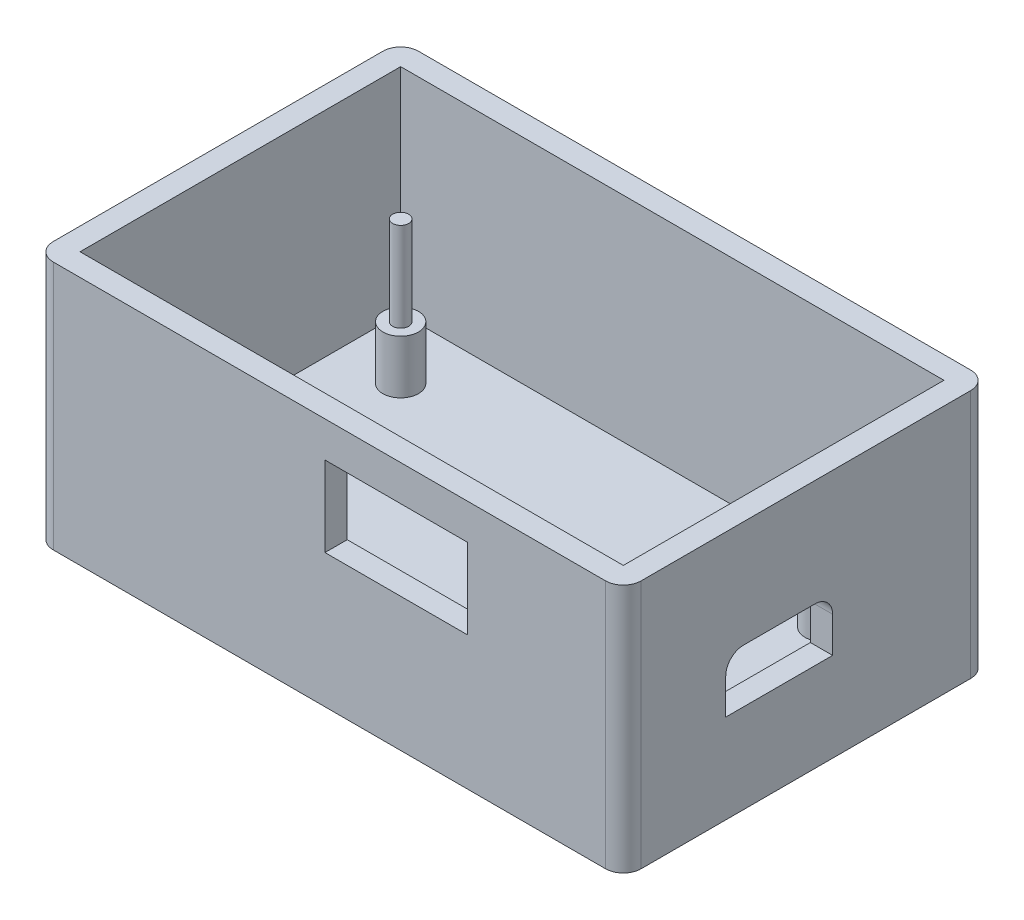
ISO-10303-21;
HEADER;
FILE_DESCRIPTION(('STEP AP214'),'2;1');
FILE_NAME('part.step','',(''),(''),'','','');
FILE_SCHEMA(('AUTOMOTIVE_DESIGN { 1 0 10303 214 1 1 1 1 }'));
ENDSEC;
DATA;
#1=APPLICATION_CONTEXT('core data for automotive mechanical design processes');
#2=APPLICATION_PROTOCOL_DEFINITION('international standard','automotive_design',2000,#1);
#3=PRODUCT_CONTEXT('',#1,'mechanical');
#4=PRODUCT('Part','Part','',(#3));
#5=PRODUCT_RELATED_PRODUCT_CATEGORY('part','',(#4));
#6=PRODUCT_DEFINITION_FORMATION('','',#4);
#7=PRODUCT_DEFINITION_CONTEXT('part definition',#1,'design');
#8=PRODUCT_DEFINITION('design','',#6,#7);
#9=PRODUCT_DEFINITION_SHAPE('','',#8);
#10=(LENGTH_UNIT() NAMED_UNIT(*) SI_UNIT(.MILLI.,.METRE.));
#11=(NAMED_UNIT(*) PLANE_ANGLE_UNIT() SI_UNIT($,.RADIAN.));
#12=(NAMED_UNIT(*) SI_UNIT($,.STERADIAN.) SOLID_ANGLE_UNIT());
#13=UNCERTAINTY_MEASURE_WITH_UNIT(LENGTH_MEASURE(1.E-05),#10,'distance_accuracy_value','');
#14=(GEOMETRIC_REPRESENTATION_CONTEXT(3) GLOBAL_UNCERTAINTY_ASSIGNED_CONTEXT((#13)) GLOBAL_UNIT_ASSIGNED_CONTEXT((#10,
#11,#12)) REPRESENTATION_CONTEXT('',''));
#15=CARTESIAN_POINT('',(0.,0.,0.));
#16=DIRECTION('',(0.,0.,1.));
#17=DIRECTION('',(1.,0.,0.));
#18=AXIS2_PLACEMENT_3D('',#15,#16,#17);
#19=CARTESIAN_POINT('',(-7.5,4.,7.5));
#20=DIRECTION('',(0.,0.,-1.));
#21=DIRECTION('',(-1.,0.,0.));
#22=AXIS2_PLACEMENT_3D('',#19,#20,#21);
#23=PLANE('',#22);
#24=DIRECTION('',(1.,0.,0.));
#25=VECTOR('',#24,1.);
#26=CARTESIAN_POINT('',(25.,15.,7.5));
#27=LINE('',#26,#25);
#28=CARTESIAN_POINT('',(25.,15.,7.5));
#29=VERTEX_POINT('',#28);
#30=CARTESIAN_POINT('',(41.,15.,7.5));
#31=VERTEX_POINT('',#30);
#32=EDGE_CURVE('E207',#29,#31,#27,.T.);
#33=ORIENTED_EDGE('',*,*,#32,.F.);
#34=DIRECTION('',(0.,-1.,0.));
#35=VECTOR('',#34,1.);
#36=CARTESIAN_POINT('',(25.,24.,7.5));
#37=LINE('',#36,#35);
#38=CARTESIAN_POINT('',(25.,24.,7.5));
#39=VERTEX_POINT('',#38);
#40=EDGE_CURVE('E61',#39,#29,#37,.T.);
#41=ORIENTED_EDGE('',*,*,#40,.F.);
#42=DIRECTION('',(1.,0.,0.));
#43=VECTOR('',#42,1.);
#44=CARTESIAN_POINT('',(25.,24.,7.5));
#45=LINE('',#44,#43);
#46=CARTESIAN_POINT('',(41.,24.,7.5));
#47=VERTEX_POINT('',#46);
#48=EDGE_CURVE('E214',#39,#47,#45,.T.);
#49=ORIENTED_EDGE('',*,*,#48,.T.);
#50=DIRECTION('',(0.,-1.,0.));
#51=VECTOR('',#50,1.);
#52=CARTESIAN_POINT('',(41.,24.,7.5));
#53=LINE('',#52,#51);
#54=EDGE_CURVE('E197',#47,#31,#53,.T.);
#55=ORIENTED_EDGE('',*,*,#54,.T.);
#56=EDGE_LOOP('',(#33,#41,#49,#55));
#57=FACE_BOUND('',#56,.T.);
#58=DIRECTION('',(1.,0.,0.));
#59=VECTOR('',#58,1.);
#60=CARTESIAN_POINT('',(-7.5,28.,7.5));
#61=LINE('',#60,#59);
#62=CARTESIAN_POINT('',(-5.5,28.,7.5));
#63=VERTEX_POINT('',#62);
#64=CARTESIAN_POINT('',(56.5,28.,7.5));
#65=VERTEX_POINT('',#64);
#66=EDGE_CURVE('E341',#63,#65,#61,.T.);
#67=ORIENTED_EDGE('',*,*,#66,.F.);
#68=DIRECTION('',(0.,-1.,0.));
#69=VECTOR('',#68,1.);
#70=CARTESIAN_POINT('',(-5.5,4.,7.5));
#71=LINE('',#70,#69);
#72=CARTESIAN_POINT('',(-5.5,0.,7.5));
#73=VERTEX_POINT('',#72);
#74=EDGE_CURVE('E404',#63,#73,#71,.T.);
#75=ORIENTED_EDGE('',*,*,#74,.T.);
#76=DIRECTION('',(1.,0.,0.));
#77=VECTOR('',#76,1.);
#78=CARTESIAN_POINT('',(-7.5,0.,7.5));
#79=LINE('',#78,#77);
#80=CARTESIAN_POINT('',(56.5,0.,7.5));
#81=VERTEX_POINT('',#80);
#82=EDGE_CURVE('E357',#73,#81,#79,.T.);
#83=ORIENTED_EDGE('',*,*,#82,.T.);
#84=DIRECTION('',(0.,-1.,0.));
#85=VECTOR('',#84,1.);
#86=CARTESIAN_POINT('',(56.5,4.,7.5));
#87=LINE('',#86,#85);
#88=EDGE_CURVE('E401',#81,#65,#87,.F.);
#89=ORIENTED_EDGE('',*,*,#88,.T.);
#90=EDGE_LOOP('',(#67,#75,#83,#89));
#91=FACE_BOUND('',#90,.T.);
#92=ADVANCED_FACE('F45',(#57,#91),#23,.F.);
#93=CARTESIAN_POINT('',(58.5,4.,7.5));
#94=DIRECTION('',(-1.,0.,0.));
#95=DIRECTION('',(0.,0.,1.));
#96=AXIS2_PLACEMENT_3D('',#93,#94,#95);
#97=PLANE('',#96);
#98=DIRECTION('',(0.,0.,-1.));
#99=VECTOR('',#98,1.);
#100=CARTESIAN_POINT('',(58.5,10.,-4.));
#101=LINE('',#100,#99);
#102=CARTESIAN_POINT('',(58.5,10.,-4.));
#103=VERTEX_POINT('',#102);
#104=CARTESIAN_POINT('',(58.5,10.,-16.));
#105=VERTEX_POINT('',#104);
#106=EDGE_CURVE('E231',#103,#105,#101,.T.);
#107=ORIENTED_EDGE('',*,*,#106,.F.);
#108=DIRECTION('',(0.,-1.,0.));
#109=VECTOR('',#108,1.);
#110=CARTESIAN_POINT('',(58.5,16.,-4.));
#111=LINE('',#110,#109);
#112=CARTESIAN_POINT('',(58.5,14.,-4.));
#113=VERTEX_POINT('',#112);
#114=EDGE_CURVE('E224',#113,#103,#111,.T.);
#115=ORIENTED_EDGE('',*,*,#114,.F.);
#116=CARTESIAN_POINT('',(58.5,14.,-6.));
#117=DIRECTION('',(-1.,0.,0.));
#118=DIRECTION('',(0.,0.,1.));
#119=AXIS2_PLACEMENT_3D('',#116,#117,#118);
#120=CIRCLE('',#119,2.);
#121=CARTESIAN_POINT('',(58.5,16.,-6.));
#122=VERTEX_POINT('',#121);
#123=EDGE_CURVE('E467',#113,#122,#120,.T.);
#124=ORIENTED_EDGE('',*,*,#123,.T.);
#125=DIRECTION('',(0.,0.,1.));
#126=VECTOR('',#125,1.);
#127=CARTESIAN_POINT('',(58.5,16.,-4.));
#128=LINE('',#127,#126);
#129=CARTESIAN_POINT('',(58.5,16.,-14.));
#130=VERTEX_POINT('',#129);
#131=EDGE_CURVE('E239',#130,#122,#128,.T.);
#132=ORIENTED_EDGE('',*,*,#131,.F.);
#133=CARTESIAN_POINT('',(58.5,14.,-14.));
#134=DIRECTION('',(-1.,0.,0.));
#135=DIRECTION('',(0.,0.,1.));
#136=AXIS2_PLACEMENT_3D('',#133,#134,#135);
#137=CIRCLE('',#136,2.);
#138=CARTESIAN_POINT('',(58.5,14.,-16.));
#139=VERTEX_POINT('',#138);
#140=EDGE_CURVE('E473',#130,#139,#137,.T.);
#141=ORIENTED_EDGE('',*,*,#140,.T.);
#142=DIRECTION('',(0.,1.,0.));
#143=VECTOR('',#142,1.);
#144=CARTESIAN_POINT('',(58.5,16.,-16.));
#145=LINE('',#144,#143);
#146=EDGE_CURVE('E235',#105,#139,#145,.T.);
#147=ORIENTED_EDGE('',*,*,#146,.F.);
#148=EDGE_LOOP('',(#107,#115,#124,#132,#141,#147));
#149=FACE_BOUND('',#148,.T.);
#150=DIRECTION('',(0.,0.,-1.));
#151=VECTOR('',#150,1.);
#152=CARTESIAN_POINT('',(58.5,0.,7.5));
#153=LINE('',#152,#151);
#154=CARTESIAN_POINT('',(58.5,0.,5.5));
#155=VERTEX_POINT('',#154);
#156=CARTESIAN_POINT('',(58.5,0.,-31.5));
#157=VERTEX_POINT('',#156);
#158=EDGE_CURVE('E361',#155,#157,#153,.T.);
#159=ORIENTED_EDGE('',*,*,#158,.T.);
#160=DIRECTION('',(0.,-1.,0.));
#161=VECTOR('',#160,1.);
#162=CARTESIAN_POINT('',(58.5,4.,-31.5));
#163=LINE('',#162,#161);
#164=CARTESIAN_POINT('',(58.5,28.,-31.5));
#165=VERTEX_POINT('',#164);
#166=EDGE_CURVE('E450',#157,#165,#163,.F.);
#167=ORIENTED_EDGE('',*,*,#166,.T.);
#168=DIRECTION('',(0.,0.,-1.));
#169=VECTOR('',#168,1.);
#170=CARTESIAN_POINT('',(58.5,28.,7.5));
#171=LINE('',#170,#169);
#172=CARTESIAN_POINT('',(58.5,28.,5.5));
#173=VERTEX_POINT('',#172);
#174=EDGE_CURVE('E345',#173,#165,#171,.T.);
#175=ORIENTED_EDGE('',*,*,#174,.F.);
#176=DIRECTION('',(0.,-1.,0.));
#177=VECTOR('',#176,1.);
#178=CARTESIAN_POINT('',(58.5,4.,5.5));
#179=LINE('',#178,#177);
#180=EDGE_CURVE('E446',#173,#155,#179,.T.);
#181=ORIENTED_EDGE('',*,*,#180,.T.);
#182=EDGE_LOOP('',(#159,#167,#175,#181));
#183=FACE_BOUND('',#182,.T.);
#184=ADVANCED_FACE('F506',(#149,#183),#97,.F.);
#185=CARTESIAN_POINT('',(-7.5,4.,-33.5));
#186=DIRECTION('',(0.,0.,1.));
#187=DIRECTION('',(1.,0.,0.));
#188=AXIS2_PLACEMENT_3D('',#185,#186,#187);
#189=PLANE('',#188);
#190=DIRECTION('',(-1.,0.,0.));
#191=VECTOR('',#190,1.);
#192=CARTESIAN_POINT('',(-7.5,0.,-33.5));
#193=LINE('',#192,#191);
#194=CARTESIAN_POINT('',(56.5,0.,-33.5));
#195=VERTEX_POINT('',#194);
#196=CARTESIAN_POINT('',(-5.5,0.,-33.5));
#197=VERTEX_POINT('',#196);
#198=EDGE_CURVE('E365',#195,#197,#193,.T.);
#199=ORIENTED_EDGE('',*,*,#198,.T.);
#200=DIRECTION('',(0.,-1.,0.));
#201=VECTOR('',#200,1.);
#202=CARTESIAN_POINT('',(-5.5,4.,-33.5));
#203=LINE('',#202,#201);
#204=CARTESIAN_POINT('',(-5.5,28.,-33.5));
#205=VERTEX_POINT('',#204);
#206=EDGE_CURVE('E443',#197,#205,#203,.F.);
#207=ORIENTED_EDGE('',*,*,#206,.T.);
#208=DIRECTION('',(-1.,0.,0.));
#209=VECTOR('',#208,1.);
#210=CARTESIAN_POINT('',(58.5,28.,-33.5));
#211=LINE('',#210,#209);
#212=CARTESIAN_POINT('',(56.5,28.,-33.5));
#213=VERTEX_POINT('',#212);
#214=EDGE_CURVE('E349',#213,#205,#211,.T.);
#215=ORIENTED_EDGE('',*,*,#214,.F.);
#216=DIRECTION('',(0.,-1.,0.));
#217=VECTOR('',#216,1.);
#218=CARTESIAN_POINT('',(56.5,4.,-33.5));
#219=LINE('',#218,#217);
#220=EDGE_CURVE('E439',#213,#195,#219,.T.);
#221=ORIENTED_EDGE('',*,*,#220,.T.);
#222=EDGE_LOOP('',(#199,#207,#215,#221));
#223=FACE_BOUND('',#222,.T.);
#224=ADVANCED_FACE('F511',(#223),#189,.F.);
#225=CARTESIAN_POINT('',(-7.5,4.,7.5));
#226=DIRECTION('',(1.,0.,0.));
#227=DIRECTION('',(0.,0.,-1.));
#228=AXIS2_PLACEMENT_3D('',#225,#226,#227);
#229=PLANE('',#228);
#230=DIRECTION('',(0.,0.,1.));
#231=VECTOR('',#230,1.);
#232=CARTESIAN_POINT('',(-7.5,0.,7.5));
#233=LINE('',#232,#231);
#234=CARTESIAN_POINT('',(-7.5,0.,-31.5));
#235=VERTEX_POINT('',#234);
#236=CARTESIAN_POINT('',(-7.5,0.,5.5));
#237=VERTEX_POINT('',#236);
#238=EDGE_CURVE('E369',#235,#237,#233,.T.);
#239=ORIENTED_EDGE('',*,*,#238,.T.);
#240=DIRECTION('',(0.,-1.,0.));
#241=VECTOR('',#240,1.);
#242=CARTESIAN_POINT('',(-7.5,4.,5.5));
#243=LINE('',#242,#241);
#244=CARTESIAN_POINT('',(-7.5,28.,5.5));
#245=VERTEX_POINT('',#244);
#246=EDGE_CURVE('E424',#237,#245,#243,.F.);
#247=ORIENTED_EDGE('',*,*,#246,.T.);
#248=DIRECTION('',(0.,0.,1.));
#249=VECTOR('',#248,1.);
#250=CARTESIAN_POINT('',(-7.5,28.,-33.5));
#251=LINE('',#250,#249);
#252=CARTESIAN_POINT('',(-7.5,28.,-31.5));
#253=VERTEX_POINT('',#252);
#254=EDGE_CURVE('E353',#253,#245,#251,.T.);
#255=ORIENTED_EDGE('',*,*,#254,.F.);
#256=DIRECTION('',(0.,-1.,0.));
#257=VECTOR('',#256,1.);
#258=CARTESIAN_POINT('',(-7.5,4.,-31.5));
#259=LINE('',#258,#257);
#260=EDGE_CURVE('E420',#253,#235,#259,.T.);
#261=ORIENTED_EDGE('',*,*,#260,.T.);
#262=EDGE_LOOP('',(#239,#247,#255,#261));
#263=FACE_BOUND('',#262,.T.);
#264=ADVANCED_FACE('F659',(#263),#229,.F.);
#265=CARTESIAN_POINT('',(0.,0.,0.));
#266=DIRECTION('',(0.,1.,0.));
#267=DIRECTION('',(0.,0.,1.));
#268=AXIS2_PLACEMENT_3D('',#265,#266,#267);
#269=PLANE('',#268);
#270=ORIENTED_EDGE('',*,*,#82,.F.);
#271=CARTESIAN_POINT('',(-5.5,0.,5.5));
#272=DIRECTION('',(0.,1.,0.));
#273=DIRECTION('',(0.,0.,1.));
#274=AXIS2_PLACEMENT_3D('',#271,#272,#273);
#275=CIRCLE('',#274,2.);
#276=EDGE_CURVE('E417',#73,#237,#275,.F.);
#277=ORIENTED_EDGE('',*,*,#276,.T.);
#278=ORIENTED_EDGE('',*,*,#238,.F.);
#279=CARTESIAN_POINT('',(-5.5,0.,-31.5));
#280=DIRECTION('',(0.,1.,0.));
#281=DIRECTION('',(0.,0.,1.));
#282=AXIS2_PLACEMENT_3D('',#279,#280,#281);
#283=CIRCLE('',#282,2.);
#284=EDGE_CURVE('E414',#235,#197,#283,.F.);
#285=ORIENTED_EDGE('',*,*,#284,.T.);
#286=ORIENTED_EDGE('',*,*,#198,.F.);
#287=CARTESIAN_POINT('',(56.5,0.,-31.5));
#288=DIRECTION('',(0.,1.,0.));
#289=DIRECTION('',(0.,0.,1.));
#290=AXIS2_PLACEMENT_3D('',#287,#288,#289);
#291=CIRCLE('',#290,2.);
#292=EDGE_CURVE('E411',#195,#157,#291,.F.);
#293=ORIENTED_EDGE('',*,*,#292,.T.);
#294=ORIENTED_EDGE('',*,*,#158,.F.);
#295=CARTESIAN_POINT('',(56.5,0.,5.5));
#296=DIRECTION('',(0.,1.,0.));
#297=DIRECTION('',(0.,0.,1.));
#298=AXIS2_PLACEMENT_3D('',#295,#296,#297);
#299=CIRCLE('',#298,2.);
#300=EDGE_CURVE('E408',#155,#81,#299,.F.);
#301=ORIENTED_EDGE('',*,*,#300,.T.);
#302=EDGE_LOOP('',(#270,#277,#278,#285,#286,#293,#294,#301));
#303=FACE_BOUND('',#302,.T.);
#304=ADVANCED_FACE('F652',(#303),#269,.F.);
#305=CARTESIAN_POINT('',(0.,28.,0.));
#306=DIRECTION('',(0.,1.,0.));
#307=DIRECTION('',(0.,0.,1.));
#308=AXIS2_PLACEMENT_3D('',#305,#306,#307);
#309=PLANE('',#308);
#310=ORIENTED_EDGE('',*,*,#254,.T.);
#311=CARTESIAN_POINT('',(-5.5,28.,5.5));
#312=DIRECTION('',(0.,1.,0.));
#313=DIRECTION('',(0.,0.,1.));
#314=AXIS2_PLACEMENT_3D('',#311,#312,#313);
#315=CIRCLE('',#314,2.);
#316=EDGE_CURVE('E436',#245,#63,#315,.T.);
#317=ORIENTED_EDGE('',*,*,#316,.T.);
#318=ORIENTED_EDGE('',*,*,#66,.T.);
#319=CARTESIAN_POINT('',(56.5,28.,5.5));
#320=DIRECTION('',(0.,1.,0.));
#321=DIRECTION('',(0.,0.,1.));
#322=AXIS2_PLACEMENT_3D('',#319,#320,#321);
#323=CIRCLE('',#322,2.);
#324=EDGE_CURVE('E427',#65,#173,#323,.T.);
#325=ORIENTED_EDGE('',*,*,#324,.T.);
#326=ORIENTED_EDGE('',*,*,#174,.T.);
#327=CARTESIAN_POINT('',(56.5,28.,-31.5));
#328=DIRECTION('',(0.,1.,0.));
#329=DIRECTION('',(0.,0.,1.));
#330=AXIS2_PLACEMENT_3D('',#327,#328,#329);
#331=CIRCLE('',#330,2.);
#332=EDGE_CURVE('E430',#165,#213,#331,.T.);
#333=ORIENTED_EDGE('',*,*,#332,.T.);
#334=ORIENTED_EDGE('',*,*,#214,.T.);
#335=CARTESIAN_POINT('',(-5.5,28.,-31.5));
#336=DIRECTION('',(0.,1.,0.));
#337=DIRECTION('',(0.,0.,1.));
#338=AXIS2_PLACEMENT_3D('',#335,#336,#337);
#339=CIRCLE('',#338,2.);
#340=EDGE_CURVE('E433',#205,#253,#339,.T.);
#341=ORIENTED_EDGE('',*,*,#340,.T.);
#342=EDGE_LOOP('',(#310,#317,#318,#325,#326,#333,#334,#341));
#343=FACE_BOUND('',#342,.T.);
#344=DIRECTION('',(0.,0.,-1.));
#345=VECTOR('',#344,1.);
#346=CARTESIAN_POINT('',(56.,28.,5.));
#347=LINE('',#346,#345);
#348=CARTESIAN_POINT('',(56.,28.,5.));
#349=VERTEX_POINT('',#348);
#350=CARTESIAN_POINT('',(56.,28.,-31.));
#351=VERTEX_POINT('',#350);
#352=EDGE_CURVE('E304',#349,#351,#347,.T.);
#353=ORIENTED_EDGE('',*,*,#352,.F.);
#354=DIRECTION('',(1.,0.,0.));
#355=VECTOR('',#354,1.);
#356=CARTESIAN_POINT('',(-5.,28.,5.));
#357=LINE('',#356,#355);
#358=CARTESIAN_POINT('',(-5.,28.,5.));
#359=VERTEX_POINT('',#358);
#360=EDGE_CURVE('E301',#359,#349,#357,.T.);
#361=ORIENTED_EDGE('',*,*,#360,.F.);
#362=DIRECTION('',(0.,0.,1.));
#363=VECTOR('',#362,1.);
#364=CARTESIAN_POINT('',(-5.,28.,-31.));
#365=LINE('',#364,#363);
#366=CARTESIAN_POINT('',(-5.,28.,-31.));
#367=VERTEX_POINT('',#366);
#368=EDGE_CURVE('E312',#367,#359,#365,.T.);
#369=ORIENTED_EDGE('',*,*,#368,.F.);
#370=DIRECTION('',(-1.,0.,0.));
#371=VECTOR('',#370,1.);
#372=CARTESIAN_POINT('',(56.,28.,-31.));
#373=LINE('',#372,#371);
#374=EDGE_CURVE('E308',#351,#367,#373,.T.);
#375=ORIENTED_EDGE('',*,*,#374,.F.);
#376=EDGE_LOOP('',(#353,#361,#369,#375));
#377=FACE_BOUND('',#376,.T.);
#378=ADVANCED_FACE('F649',(#343,#377),#309,.T.);
#379=CARTESIAN_POINT('',(-5.,28.,5.));
#380=DIRECTION('',(0.,0.,-1.));
#381=DIRECTION('',(-1.,0.,0.));
#382=AXIS2_PLACEMENT_3D('',#379,#380,#381);
#383=PLANE('',#382);
#384=DIRECTION('',(0.,1.,0.));
#385=VECTOR('',#384,1.);
#386=CARTESIAN_POINT('',(25.,28.,5.));
#387=LINE('',#386,#385);
#388=CARTESIAN_POINT('',(25.,15.,5.));
#389=VERTEX_POINT('',#388);
#390=CARTESIAN_POINT('',(25.,24.,5.));
#391=VERTEX_POINT('',#390);
#392=EDGE_CURVE('E11',#389,#391,#387,.T.);
#393=ORIENTED_EDGE('',*,*,#392,.F.);
#394=DIRECTION('',(-1.,0.,0.));
#395=VECTOR('',#394,1.);
#396=CARTESIAN_POINT('',(-5.,15.,5.));
#397=LINE('',#396,#395);
#398=CARTESIAN_POINT('',(41.,15.,5.));
#399=VERTEX_POINT('',#398);
#400=EDGE_CURVE('E479',#399,#389,#397,.T.);
#401=ORIENTED_EDGE('',*,*,#400,.F.);
#402=DIRECTION('',(0.,1.,0.));
#403=VECTOR('',#402,1.);
#404=CARTESIAN_POINT('',(41.,28.,5.));
#405=LINE('',#404,#403);
#406=CARTESIAN_POINT('',(41.,24.,5.));
#407=VERTEX_POINT('',#406);
#408=EDGE_CURVE('E200',#399,#407,#405,.T.);
#409=ORIENTED_EDGE('',*,*,#408,.T.);
#410=DIRECTION('',(-1.,0.,0.));
#411=VECTOR('',#410,1.);
#412=CARTESIAN_POINT('',(-5.,24.,5.));
#413=LINE('',#412,#411);
#414=EDGE_CURVE('E54',#407,#391,#413,.T.);
#415=ORIENTED_EDGE('',*,*,#414,.T.);
#416=EDGE_LOOP('',(#393,#401,#409,#415));
#417=FACE_BOUND('',#416,.T.);
#418=DIRECTION('',(1.,0.,0.));
#419=VECTOR('',#418,1.);
#420=CARTESIAN_POINT('',(-5.,4.,5.));
#421=LINE('',#420,#419);
#422=CARTESIAN_POINT('',(-5.,4.,5.));
#423=VERTEX_POINT('',#422);
#424=CARTESIAN_POINT('',(56.,4.,5.));
#425=VERTEX_POINT('',#424);
#426=EDGE_CURVE('E300',#423,#425,#421,.T.);
#427=ORIENTED_EDGE('',*,*,#426,.F.);
#428=DIRECTION('',(0.,-1.,0.));
#429=VECTOR('',#428,1.);
#430=CARTESIAN_POINT('',(-5.,28.,5.));
#431=LINE('',#430,#429);
#432=EDGE_CURVE('E315',#359,#423,#431,.T.);
#433=ORIENTED_EDGE('',*,*,#432,.F.);
#434=ORIENTED_EDGE('',*,*,#360,.T.);
#435=DIRECTION('',(0.,-1.,0.));
#436=VECTOR('',#435,1.);
#437=CARTESIAN_POINT('',(56.,28.,5.));
#438=LINE('',#437,#436);
#439=EDGE_CURVE('E337',#349,#425,#438,.T.);
#440=ORIENTED_EDGE('',*,*,#439,.T.);
#441=EDGE_LOOP('',(#427,#433,#434,#440));
#442=FACE_BOUND('',#441,.T.);
#443=ADVANCED_FACE('F487',(#417,#442),#383,.T.);
#444=CARTESIAN_POINT('',(56.,28.,5.));
#445=DIRECTION('',(-1.,0.,0.));
#446=DIRECTION('',(0.,0.,1.));
#447=AXIS2_PLACEMENT_3D('',#444,#445,#446);
#448=PLANE('',#447);
#449=DIRECTION('',(0.,1.,0.));
#450=VECTOR('',#449,1.);
#451=CARTESIAN_POINT('',(56.,28.,-4.));
#452=LINE('',#451,#450);
#453=CARTESIAN_POINT('',(56.,10.,-4.));
#454=VERTEX_POINT('',#453);
#455=CARTESIAN_POINT('',(56.,14.,-4.));
#456=VERTEX_POINT('',#455);
#457=EDGE_CURVE('E397',#454,#456,#452,.T.);
#458=ORIENTED_EDGE('',*,*,#457,.F.);
#459=DIRECTION('',(0.,0.,1.));
#460=VECTOR('',#459,1.);
#461=CARTESIAN_POINT('',(56.,10.,5.));
#462=LINE('',#461,#460);
#463=CARTESIAN_POINT('',(56.,10.,-16.));
#464=VERTEX_POINT('',#463);
#465=EDGE_CURVE('E384',#464,#454,#462,.T.);
#466=ORIENTED_EDGE('',*,*,#465,.F.);
#467=DIRECTION('',(0.,-1.,0.));
#468=VECTOR('',#467,1.);
#469=CARTESIAN_POINT('',(56.,28.,-16.));
#470=LINE('',#469,#468);
#471=CARTESIAN_POINT('',(56.,14.,-16.));
#472=VERTEX_POINT('',#471);
#473=EDGE_CURVE('E390',#472,#464,#470,.T.);
#474=ORIENTED_EDGE('',*,*,#473,.F.);
#475=CARTESIAN_POINT('',(56.,14.,-14.));
#476=DIRECTION('',(-1.,0.,0.));
#477=DIRECTION('',(0.,0.,1.));
#478=AXIS2_PLACEMENT_3D('',#475,#476,#477);
#479=CIRCLE('',#478,2.);
#480=CARTESIAN_POINT('',(56.,16.,-14.));
#481=VERTEX_POINT('',#480);
#482=EDGE_CURVE('E476',#472,#481,#479,.F.);
#483=ORIENTED_EDGE('',*,*,#482,.T.);
#484=DIRECTION('',(0.,0.,-1.));
#485=VECTOR('',#484,1.);
#486=CARTESIAN_POINT('',(56.,16.,5.));
#487=LINE('',#486,#485);
#488=CARTESIAN_POINT('',(56.,16.,-6.));
#489=VERTEX_POINT('',#488);
#490=EDGE_CURVE('E393',#489,#481,#487,.T.);
#491=ORIENTED_EDGE('',*,*,#490,.F.);
#492=CARTESIAN_POINT('',(56.,14.,-6.));
#493=DIRECTION('',(-1.,0.,0.));
#494=DIRECTION('',(0.,0.,1.));
#495=AXIS2_PLACEMENT_3D('',#492,#493,#494);
#496=CIRCLE('',#495,2.);
#497=EDGE_CURVE('E470',#489,#456,#496,.F.);
#498=ORIENTED_EDGE('',*,*,#497,.T.);
#499=EDGE_LOOP('',(#458,#466,#474,#483,#491,#498));
#500=FACE_BOUND('',#499,.T.);
#501=DIRECTION('',(0.,0.,-1.));
#502=VECTOR('',#501,1.);
#503=CARTESIAN_POINT('',(56.,4.,5.));
#504=LINE('',#503,#502);
#505=CARTESIAN_POINT('',(56.,4.,-31.));
#506=VERTEX_POINT('',#505);
#507=EDGE_CURVE('E318',#425,#506,#504,.T.);
#508=ORIENTED_EDGE('',*,*,#507,.F.);
#509=ORIENTED_EDGE('',*,*,#439,.F.);
#510=ORIENTED_EDGE('',*,*,#352,.T.);
#511=DIRECTION('',(0.,-1.,0.));
#512=VECTOR('',#511,1.);
#513=CARTESIAN_POINT('',(56.,28.,-31.));
#514=LINE('',#513,#512);
#515=EDGE_CURVE('E333',#351,#506,#514,.T.);
#516=ORIENTED_EDGE('',*,*,#515,.T.);
#517=EDGE_LOOP('',(#508,#509,#510,#516));
#518=FACE_BOUND('',#517,.T.);
#519=ADVANCED_FACE('F543',(#500,#518),#448,.T.);
#520=CARTESIAN_POINT('',(56.,28.,-31.));
#521=DIRECTION('',(0.,0.,1.));
#522=DIRECTION('',(1.,0.,0.));
#523=AXIS2_PLACEMENT_3D('',#520,#521,#522);
#524=PLANE('',#523);
#525=DIRECTION('',(-1.,0.,0.));
#526=VECTOR('',#525,1.);
#527=CARTESIAN_POINT('',(56.,4.,-31.));
#528=LINE('',#527,#526);
#529=CARTESIAN_POINT('',(-5.,4.,-31.));
#530=VERTEX_POINT('',#529);
#531=EDGE_CURVE('E321',#506,#530,#528,.T.);
#532=ORIENTED_EDGE('',*,*,#531,.F.);
#533=ORIENTED_EDGE('',*,*,#515,.F.);
#534=ORIENTED_EDGE('',*,*,#374,.T.);
#535=DIRECTION('',(0.,-1.,0.));
#536=VECTOR('',#535,1.);
#537=CARTESIAN_POINT('',(-5.,28.,-31.));
#538=LINE('',#537,#536);
#539=EDGE_CURVE('E329',#367,#530,#538,.T.);
#540=ORIENTED_EDGE('',*,*,#539,.T.);
#541=EDGE_LOOP('',(#532,#533,#534,#540));
#542=FACE_BOUND('',#541,.T.);
#543=ADVANCED_FACE('F641',(#542),#524,.T.);
#544=CARTESIAN_POINT('',(-5.,28.,-31.));
#545=DIRECTION('',(1.,0.,0.));
#546=DIRECTION('',(0.,0.,-1.));
#547=AXIS2_PLACEMENT_3D('',#544,#545,#546);
#548=PLANE('',#547);
#549=DIRECTION('',(0.,0.,1.));
#550=VECTOR('',#549,1.);
#551=CARTESIAN_POINT('',(-5.,4.,-31.));
#552=LINE('',#551,#550);
#553=EDGE_CURVE('E305',#530,#423,#552,.T.);
#554=ORIENTED_EDGE('',*,*,#553,.F.);
#555=ORIENTED_EDGE('',*,*,#539,.F.);
#556=ORIENTED_EDGE('',*,*,#368,.T.);
#557=ORIENTED_EDGE('',*,*,#432,.T.);
#558=EDGE_LOOP('',(#554,#555,#556,#557));
#559=FACE_BOUND('',#558,.T.);
#560=ADVANCED_FACE('F638',(#559),#548,.T.);
#561=CARTESIAN_POINT('',(0.,4.,0.));
#562=DIRECTION('',(0.,1.,0.));
#563=DIRECTION('',(0.,0.,1.));
#564=AXIS2_PLACEMENT_3D('',#561,#562,#563);
#565=PLANE('',#564);
#566=CARTESIAN_POINT('',(49.2,4.,-24.2));
#567=DIRECTION('',(0.,1.,0.));
#568=DIRECTION('',(0.,0.,-1.));
#569=AXIS2_PLACEMENT_3D('',#566,#567,#568);
#570=CIRCLE('',#569,2.);
#571=CARTESIAN_POINT('',(49.2,4.,-26.2));
#572=VERTEX_POINT('',#571);
#573=EDGE_CURVE('E268',#572,#572,#570,.T.);
#574=ORIENTED_EDGE('',*,*,#573,.F.);
#575=EDGE_LOOP('',(#574));
#576=FACE_BOUND('',#575,.T.);
#577=CARTESIAN_POINT('',(49.2,4.,-1.79999999999998));
#578=DIRECTION('',(0.,1.,0.));
#579=DIRECTION('',(0.,0.,1.));
#580=AXIS2_PLACEMENT_3D('',#577,#578,#579);
#581=CIRCLE('',#580,2.);
#582=CARTESIAN_POINT('',(49.2,4.,0.200000000000021));
#583=VERTEX_POINT('',#582);
#584=EDGE_CURVE('E260',#583,#583,#581,.T.);
#585=ORIENTED_EDGE('',*,*,#584,.F.);
#586=EDGE_LOOP('',(#585));
#587=FACE_BOUND('',#586,.T.);
#588=CARTESIAN_POINT('',(1.80000000000001,4.,-1.79999999999999));
#589=DIRECTION('',(0.,1.,0.));
#590=DIRECTION('',(0.,0.,-1.));
#591=AXIS2_PLACEMENT_3D('',#588,#589,#590);
#592=CIRCLE('',#591,2.);
#593=CARTESIAN_POINT('',(1.80000000000001,4.,-3.79999999999999));
#594=VERTEX_POINT('',#593);
#595=EDGE_CURVE('E251',#594,#594,#592,.T.);
#596=ORIENTED_EDGE('',*,*,#595,.F.);
#597=EDGE_LOOP('',(#596));
#598=FACE_BOUND('',#597,.T.);
#599=CARTESIAN_POINT('',(1.8,4.,-24.2));
#600=DIRECTION('',(0.,1.,0.));
#601=DIRECTION('',(0.,0.,1.));
#602=AXIS2_PLACEMENT_3D('',#599,#600,#601);
#603=CIRCLE('',#602,2.);
#604=CARTESIAN_POINT('',(1.8,4.,-22.2));
#605=VERTEX_POINT('',#604);
#606=EDGE_CURVE('E255',#605,#605,#603,.T.);
#607=ORIENTED_EDGE('',*,*,#606,.F.);
#608=EDGE_LOOP('',(#607));
#609=FACE_BOUND('',#608,.T.);
#610=ORIENTED_EDGE('',*,*,#426,.T.);
#611=ORIENTED_EDGE('',*,*,#507,.T.);
#612=ORIENTED_EDGE('',*,*,#531,.T.);
#613=ORIENTED_EDGE('',*,*,#553,.T.);
#614=EDGE_LOOP('',(#610,#611,#612,#613));
#615=FACE_BOUND('',#614,.T.);
#616=ADVANCED_FACE('F596',(#576,#587,#598,#609,#615),#565,.T.);
#617=CARTESIAN_POINT('',(49.2,10.,-24.2));
#618=DIRECTION('',(0.,-1.,0.));
#619=DIRECTION('',(0.,0.,-1.));
#620=AXIS2_PLACEMENT_3D('',#617,#618,#619);
#621=CYLINDRICAL_SURFACE('',#620,2.);
#622=CARTESIAN_POINT('',(49.2,10.,-24.2));
#623=DIRECTION('',(0.,1.,0.));
#624=DIRECTION('',(0.,0.,-1.));
#625=AXIS2_PLACEMENT_3D('',#622,#623,#624);
#626=CIRCLE('',#625,2.);
#627=CARTESIAN_POINT('',(49.2,10.,-26.2));
#628=VERTEX_POINT('',#627);
#629=EDGE_CURVE('E247',#628,#628,#626,.T.);
#630=ORIENTED_EDGE('',*,*,#629,.F.);
#631=EDGE_LOOP('',(#630));
#632=FACE_BOUND('',#631,.T.);
#633=ORIENTED_EDGE('',*,*,#573,.T.);
#634=EDGE_LOOP('',(#633));
#635=FACE_BOUND('',#634,.T.);
#636=ADVANCED_FACE('F592',(#632,#635),#621,.T.);
#637=CARTESIAN_POINT('',(49.2,10.,-24.2));
#638=DIRECTION('',(0.,-1.,0.));
#639=DIRECTION('',(0.,0.,-1.));
#640=AXIS2_PLACEMENT_3D('',#637,#638,#639);
#641=PLANE('',#640);
#642=CARTESIAN_POINT('',(49.2,10.,-24.2));
#643=DIRECTION('',(0.,-1.,0.));
#644=DIRECTION('',(0.,0.,-1.));
#645=AXIS2_PLACEMENT_3D('',#642,#643,#644);
#646=CIRCLE('',#645,0.899999999999997);
#647=CARTESIAN_POINT('',(49.2,10.,-25.1));
#648=VERTEX_POINT('',#647);
#649=EDGE_CURVE('E373',#648,#648,#646,.T.);
#650=ORIENTED_EDGE('',*,*,#649,.T.);
#651=EDGE_LOOP('',(#650));
#652=FACE_BOUND('',#651,.T.);
#653=ORIENTED_EDGE('',*,*,#629,.T.);
#654=EDGE_LOOP('',(#653));
#655=FACE_BOUND('',#654,.T.);
#656=ADVANCED_FACE('F595',(#652,#655),#641,.F.);
#657=CARTESIAN_POINT('',(49.2,20.,-24.2));
#658=DIRECTION('',(0.,-1.,0.));
#659=DIRECTION('',(0.,0.,-1.));
#660=AXIS2_PLACEMENT_3D('',#657,#658,#659);
#661=PLANE('',#660);
#662=CARTESIAN_POINT('',(49.2,20.,-24.2));
#663=DIRECTION('',(0.,1.,0.));
#664=DIRECTION('',(0.,0.,-1.));
#665=AXIS2_PLACEMENT_3D('',#662,#663,#664);
#666=CIRCLE('',#665,0.899999999999997);
#667=CARTESIAN_POINT('',(49.2,20.,-25.1));
#668=VERTEX_POINT('',#667);
#669=EDGE_CURVE('E292',#668,#668,#666,.T.);
#670=ORIENTED_EDGE('',*,*,#669,.T.);
#671=EDGE_LOOP('',(#670));
#672=FACE_BOUND('',#671,.T.);
#673=ADVANCED_FACE('F600',(#672),#661,.F.);
#674=CARTESIAN_POINT('',(49.2,20.,-24.2));
#675=DIRECTION('',(0.,-1.,0.));
#676=DIRECTION('',(0.,0.,-1.));
#677=AXIS2_PLACEMENT_3D('',#674,#675,#676);
#678=CYLINDRICAL_SURFACE('',#677,0.899999999999997);
#679=ORIENTED_EDGE('',*,*,#669,.F.);
#680=EDGE_LOOP('',(#679));
#681=FACE_BOUND('',#680,.T.);
#682=ORIENTED_EDGE('',*,*,#649,.F.);
#683=EDGE_LOOP('',(#682));
#684=FACE_BOUND('',#683,.T.);
#685=ADVANCED_FACE('F587',(#681,#684),#678,.T.);
#686=CARTESIAN_POINT('',(49.2,10.,-1.79999999999998));
#687=DIRECTION('',(0.,-1.,0.));
#688=DIRECTION('',(0.,0.,-1.));
#689=AXIS2_PLACEMENT_3D('',#686,#687,#688);
#690=CYLINDRICAL_SURFACE('',#689,2.);
#691=CARTESIAN_POINT('',(49.2,10.,-1.79999999999998));
#692=DIRECTION('',(0.,1.,0.));
#693=DIRECTION('',(0.,0.,1.));
#694=AXIS2_PLACEMENT_3D('',#691,#692,#693);
#695=CIRCLE('',#694,2.);
#696=CARTESIAN_POINT('',(49.2,10.,0.200000000000021));
#697=VERTEX_POINT('',#696);
#698=EDGE_CURVE('E264',#697,#697,#695,.T.);
#699=ORIENTED_EDGE('',*,*,#698,.F.);
#700=EDGE_LOOP('',(#699));
#701=FACE_BOUND('',#700,.T.);
#702=ORIENTED_EDGE('',*,*,#584,.T.);
#703=EDGE_LOOP('',(#702));
#704=FACE_BOUND('',#703,.T.);
#705=ADVANCED_FACE('F584',(#701,#704),#690,.T.);
#706=CARTESIAN_POINT('',(49.2,10.,-1.79999999999998));
#707=DIRECTION('',(0.,1.,0.));
#708=DIRECTION('',(0.,0.,1.));
#709=AXIS2_PLACEMENT_3D('',#706,#707,#708);
#710=PLANE('',#709);
#711=CARTESIAN_POINT('',(49.2,10.,-1.8));
#712=DIRECTION('',(0.,1.,0.));
#713=DIRECTION('',(0.,0.,1.));
#714=AXIS2_PLACEMENT_3D('',#711,#712,#713);
#715=CIRCLE('',#714,0.899999999999997);
#716=CARTESIAN_POINT('',(49.2,10.,-0.900000000000002));
#717=VERTEX_POINT('',#716);
#718=EDGE_CURVE('E279',#717,#717,#715,.T.);
#719=ORIENTED_EDGE('',*,*,#718,.F.);
#720=EDGE_LOOP('',(#719));
#721=FACE_BOUND('',#720,.T.);
#722=ORIENTED_EDGE('',*,*,#698,.T.);
#723=EDGE_LOOP('',(#722));
#724=FACE_BOUND('',#723,.T.);
#725=ADVANCED_FACE('F578',(#721,#724),#710,.T.);
#726=CARTESIAN_POINT('',(1.80000000000001,10.,-1.79999999999999));
#727=DIRECTION('',(0.,-1.,0.));
#728=DIRECTION('',(0.,0.,-1.));
#729=AXIS2_PLACEMENT_3D('',#726,#727,#728);
#730=CYLINDRICAL_SURFACE('',#729,2.);
#731=CARTESIAN_POINT('',(1.80000000000001,10.,-1.79999999999999));
#732=DIRECTION('',(0.,1.,0.));
#733=DIRECTION('',(0.,0.,-1.));
#734=AXIS2_PLACEMENT_3D('',#731,#732,#733);
#735=CIRCLE('',#734,2.);
#736=CARTESIAN_POINT('',(1.80000000000001,10.,-3.79999999999999));
#737=VERTEX_POINT('',#736);
#738=EDGE_CURVE('E256',#737,#737,#735,.T.);
#739=ORIENTED_EDGE('',*,*,#738,.F.);
#740=EDGE_LOOP('',(#739));
#741=FACE_BOUND('',#740,.T.);
#742=ORIENTED_EDGE('',*,*,#595,.T.);
#743=EDGE_LOOP('',(#742));
#744=FACE_BOUND('',#743,.T.);
#745=ADVANCED_FACE('F574',(#741,#744),#730,.T.);
#746=CARTESIAN_POINT('',(1.80000000000001,10.,-1.79999999999999));
#747=DIRECTION('',(0.,-1.,0.));
#748=DIRECTION('',(0.,0.,-1.));
#749=AXIS2_PLACEMENT_3D('',#746,#747,#748);
#750=PLANE('',#749);
#751=CARTESIAN_POINT('',(1.80000000000001,10.,-1.8));
#752=DIRECTION('',(0.,-1.,0.));
#753=DIRECTION('',(0.,0.,-1.));
#754=AXIS2_PLACEMENT_3D('',#751,#752,#753);
#755=CIRCLE('',#754,0.9);
#756=CARTESIAN_POINT('',(1.80000000000001,10.,-2.7));
#757=VERTEX_POINT('',#756);
#758=EDGE_CURVE('E377',#757,#757,#755,.T.);
#759=ORIENTED_EDGE('',*,*,#758,.T.);
#760=EDGE_LOOP('',(#759));
#761=FACE_BOUND('',#760,.T.);
#762=ORIENTED_EDGE('',*,*,#738,.T.);
#763=EDGE_LOOP('',(#762));
#764=FACE_BOUND('',#763,.T.);
#765=ADVANCED_FACE('F577',(#761,#764),#750,.F.);
#766=CARTESIAN_POINT('',(1.80000000000001,20.,-1.8));
#767=DIRECTION('',(0.,-1.,0.));
#768=DIRECTION('',(0.,0.,-1.));
#769=AXIS2_PLACEMENT_3D('',#766,#767,#768);
#770=PLANE('',#769);
#771=CARTESIAN_POINT('',(1.80000000000001,20.,-1.8));
#772=DIRECTION('',(0.,1.,0.));
#773=DIRECTION('',(0.,0.,-1.));
#774=AXIS2_PLACEMENT_3D('',#771,#772,#773);
#775=CIRCLE('',#774,0.9);
#776=CARTESIAN_POINT('',(1.80000000000001,20.,-2.7));
#777=VERTEX_POINT('',#776);
#778=EDGE_CURVE('E283',#777,#777,#775,.T.);
#779=ORIENTED_EDGE('',*,*,#778,.T.);
#780=EDGE_LOOP('',(#779));
#781=FACE_BOUND('',#780,.T.);
#782=ADVANCED_FACE('F582',(#781),#770,.F.);
#783=CARTESIAN_POINT('',(1.80000000000001,20.,-1.8));
#784=DIRECTION('',(0.,-1.,0.));
#785=DIRECTION('',(0.,0.,-1.));
#786=AXIS2_PLACEMENT_3D('',#783,#784,#785);
#787=CYLINDRICAL_SURFACE('',#786,0.9);
#788=ORIENTED_EDGE('',*,*,#778,.F.);
#789=EDGE_LOOP('',(#788));
#790=FACE_BOUND('',#789,.T.);
#791=ORIENTED_EDGE('',*,*,#758,.F.);
#792=EDGE_LOOP('',(#791));
#793=FACE_BOUND('',#792,.T.);
#794=ADVANCED_FACE('F610',(#790,#793),#787,.T.);
#795=CARTESIAN_POINT('',(1.8,10.,-24.2));
#796=DIRECTION('',(0.,-1.,0.));
#797=DIRECTION('',(0.,0.,-1.));
#798=AXIS2_PLACEMENT_3D('',#795,#796,#797);
#799=CYLINDRICAL_SURFACE('',#798,2.);
#800=CARTESIAN_POINT('',(1.8,10.,-24.2));
#801=DIRECTION('',(0.,1.,0.));
#802=DIRECTION('',(0.,0.,1.));
#803=AXIS2_PLACEMENT_3D('',#800,#801,#802);
#804=CIRCLE('',#803,2.);
#805=CARTESIAN_POINT('',(1.8,10.,-22.2));
#806=VERTEX_POINT('',#805);
#807=EDGE_CURVE('E275',#806,#806,#804,.T.);
#808=ORIENTED_EDGE('',*,*,#807,.F.);
#809=EDGE_LOOP('',(#808));
#810=FACE_BOUND('',#809,.T.);
#811=ORIENTED_EDGE('',*,*,#606,.T.);
#812=EDGE_LOOP('',(#811));
#813=FACE_BOUND('',#812,.T.);
#814=ADVANCED_FACE('F606',(#810,#813),#799,.T.);
#815=CARTESIAN_POINT('',(1.8,10.,-24.2));
#816=DIRECTION('',(0.,1.,0.));
#817=DIRECTION('',(0.,0.,1.));
#818=AXIS2_PLACEMENT_3D('',#815,#816,#817);
#819=PLANE('',#818);
#820=CARTESIAN_POINT('',(1.8,10.,-24.2));
#821=DIRECTION('',(0.,1.,0.));
#822=DIRECTION('',(0.,0.,1.));
#823=AXIS2_PLACEMENT_3D('',#820,#821,#822);
#824=CIRCLE('',#823,0.900000000000001);
#825=CARTESIAN_POINT('',(1.8,10.,-23.3));
#826=VERTEX_POINT('',#825);
#827=EDGE_CURVE('E296',#826,#826,#824,.T.);
#828=ORIENTED_EDGE('',*,*,#827,.F.);
#829=EDGE_LOOP('',(#828));
#830=FACE_BOUND('',#829,.T.);
#831=ORIENTED_EDGE('',*,*,#807,.T.);
#832=EDGE_LOOP('',(#831));
#833=FACE_BOUND('',#832,.T.);
#834=ADVANCED_FACE('F602',(#830,#833),#819,.T.);
#835=CARTESIAN_POINT('',(49.2,20.,-1.8));
#836=DIRECTION('',(0.,1.,0.));
#837=DIRECTION('',(0.,0.,1.));
#838=AXIS2_PLACEMENT_3D('',#835,#836,#837);
#839=PLANE('',#838);
#840=CARTESIAN_POINT('',(49.2,20.,-1.8));
#841=DIRECTION('',(0.,1.,0.));
#842=DIRECTION('',(0.,0.,1.));
#843=AXIS2_PLACEMENT_3D('',#840,#841,#842);
#844=CIRCLE('',#843,0.899999999999997);
#845=CARTESIAN_POINT('',(49.2,20.,-0.900000000000002));
#846=VERTEX_POINT('',#845);
#847=EDGE_CURVE('E288',#846,#846,#844,.T.);
#848=ORIENTED_EDGE('',*,*,#847,.T.);
#849=EDGE_LOOP('',(#848));
#850=FACE_BOUND('',#849,.T.);
#851=ADVANCED_FACE('F605',(#850),#839,.T.);
#852=CARTESIAN_POINT('',(49.2,20.,-1.8));
#853=DIRECTION('',(0.,-1.,0.));
#854=DIRECTION('',(0.,0.,-1.));
#855=AXIS2_PLACEMENT_3D('',#852,#853,#854);
#856=CYLINDRICAL_SURFACE('',#855,0.899999999999997);
#857=ORIENTED_EDGE('',*,*,#718,.T.);
#858=EDGE_LOOP('',(#857));
#859=FACE_BOUND('',#858,.T.);
#860=ORIENTED_EDGE('',*,*,#847,.F.);
#861=EDGE_LOOP('',(#860));
#862=FACE_BOUND('',#861,.T.);
#863=ADVANCED_FACE('F618',(#859,#862),#856,.T.);
#864=CARTESIAN_POINT('',(1.8,20.,-24.2));
#865=DIRECTION('',(0.,1.,0.));
#866=DIRECTION('',(0.,0.,1.));
#867=AXIS2_PLACEMENT_3D('',#864,#865,#866);
#868=PLANE('',#867);
#869=CARTESIAN_POINT('',(1.8,20.,-24.2));
#870=DIRECTION('',(0.,1.,0.));
#871=DIRECTION('',(0.,0.,1.));
#872=AXIS2_PLACEMENT_3D('',#869,#870,#871);
#873=CIRCLE('',#872,0.900000000000001);
#874=CARTESIAN_POINT('',(1.8,20.,-23.3));
#875=VERTEX_POINT('',#874);
#876=EDGE_CURVE('E287',#875,#875,#873,.T.);
#877=ORIENTED_EDGE('',*,*,#876,.T.);
#878=EDGE_LOOP('',(#877));
#879=FACE_BOUND('',#878,.T.);
#880=ADVANCED_FACE('F621',(#879),#868,.T.);
#881=CARTESIAN_POINT('',(1.8,20.,-24.2));
#882=DIRECTION('',(0.,-1.,0.));
#883=DIRECTION('',(0.,0.,-1.));
#884=AXIS2_PLACEMENT_3D('',#881,#882,#883);
#885=CYLINDRICAL_SURFACE('',#884,0.900000000000001);
#886=ORIENTED_EDGE('',*,*,#827,.T.);
#887=EDGE_LOOP('',(#886));
#888=FACE_BOUND('',#887,.T.);
#889=ORIENTED_EDGE('',*,*,#876,.F.);
#890=EDGE_LOOP('',(#889));
#891=FACE_BOUND('',#890,.T.);
#892=ADVANCED_FACE('F569',(#888,#891),#885,.T.);
#893=CARTESIAN_POINT('',(52.5,16.,-4.));
#894=DIRECTION('',(0.,0.,1.));
#895=DIRECTION('',(0.,-1.,0.));
#896=AXIS2_PLACEMENT_3D('',#893,#894,#895);
#897=PLANE('',#896);
#898=ORIENTED_EDGE('',*,*,#457,.T.);
#899=DIRECTION('',(1.,0.,0.));
#900=VECTOR('',#899,1.);
#901=CARTESIAN_POINT('',(58.5,14.,-4.));
#902=LINE('',#901,#900);
#903=EDGE_CURVE('E453',#456,#113,#902,.T.);
#904=ORIENTED_EDGE('',*,*,#903,.T.);
#905=ORIENTED_EDGE('',*,*,#114,.T.);
#906=DIRECTION('',(1.,0.,0.));
#907=VECTOR('',#906,1.);
#908=CARTESIAN_POINT('',(52.5,10.,-4.));
#909=LINE('',#908,#907);
#910=EDGE_CURVE('E243',#454,#103,#909,.T.);
#911=ORIENTED_EDGE('',*,*,#910,.F.);
#912=EDGE_LOOP('',(#898,#904,#905,#911));
#913=FACE_BOUND('',#912,.T.);
#914=ADVANCED_FACE('F548',(#913),#897,.F.);
#915=CARTESIAN_POINT('',(52.5,16.,-4.));
#916=DIRECTION('',(0.,1.,0.));
#917=DIRECTION('',(0.,0.,1.));
#918=AXIS2_PLACEMENT_3D('',#915,#916,#917);
#919=PLANE('',#918);
#920=ORIENTED_EDGE('',*,*,#131,.T.);
#921=DIRECTION('',(1.,0.,0.));
#922=VECTOR('',#921,1.);
#923=CARTESIAN_POINT('',(56.,16.,-6.));
#924=LINE('',#923,#922);
#925=EDGE_CURVE('E461',#122,#489,#924,.F.);
#926=ORIENTED_EDGE('',*,*,#925,.T.);
#927=ORIENTED_EDGE('',*,*,#490,.T.);
#928=DIRECTION('',(1.,0.,0.));
#929=VECTOR('',#928,1.);
#930=CARTESIAN_POINT('',(58.5,16.,-14.));
#931=LINE('',#930,#929);
#932=EDGE_CURVE('E457',#481,#130,#931,.T.);
#933=ORIENTED_EDGE('',*,*,#932,.T.);
#934=EDGE_LOOP('',(#920,#926,#927,#933));
#935=FACE_BOUND('',#934,.T.);
#936=ADVANCED_FACE('F563',(#935),#919,.F.);
#937=CARTESIAN_POINT('',(52.5,16.,-16.));
#938=DIRECTION('',(0.,0.,-1.));
#939=DIRECTION('',(-1.,0.,0.));
#940=AXIS2_PLACEMENT_3D('',#937,#938,#939);
#941=PLANE('',#940);
#942=ORIENTED_EDGE('',*,*,#146,.T.);
#943=DIRECTION('',(1.,0.,0.));
#944=VECTOR('',#943,1.);
#945=CARTESIAN_POINT('',(56.,14.,-16.));
#946=LINE('',#945,#944);
#947=EDGE_CURVE('E464',#139,#472,#946,.F.);
#948=ORIENTED_EDGE('',*,*,#947,.T.);
#949=ORIENTED_EDGE('',*,*,#473,.T.);
#950=DIRECTION('',(1.,0.,0.));
#951=VECTOR('',#950,1.);
#952=CARTESIAN_POINT('',(52.5,10.,-16.));
#953=LINE('',#952,#951);
#954=EDGE_CURVE('E244',#464,#105,#953,.T.);
#955=ORIENTED_EDGE('',*,*,#954,.T.);
#956=EDGE_LOOP('',(#942,#948,#949,#955));
#957=FACE_BOUND('',#956,.T.);
#958=ADVANCED_FACE('F558',(#957),#941,.F.);
#959=CARTESIAN_POINT('',(52.5,10.,-4.));
#960=DIRECTION('',(0.,-1.,0.));
#961=DIRECTION('',(0.,0.,-1.));
#962=AXIS2_PLACEMENT_3D('',#959,#960,#961);
#963=PLANE('',#962);
#964=ORIENTED_EDGE('',*,*,#465,.T.);
#965=ORIENTED_EDGE('',*,*,#910,.T.);
#966=ORIENTED_EDGE('',*,*,#106,.T.);
#967=ORIENTED_EDGE('',*,*,#954,.F.);
#968=EDGE_LOOP('',(#964,#965,#966,#967));
#969=FACE_BOUND('',#968,.T.);
#970=ADVANCED_FACE('F520',(#969),#963,.F.);
#971=CARTESIAN_POINT('',(-5.5,4.,5.5));
#972=DIRECTION('',(0.,-1.,0.));
#973=DIRECTION('',(0.,0.,-1.));
#974=AXIS2_PLACEMENT_3D('',#971,#972,#973);
#975=CYLINDRICAL_SURFACE('',#974,2.);
#976=ORIENTED_EDGE('',*,*,#316,.F.);
#977=ORIENTED_EDGE('',*,*,#246,.F.);
#978=ORIENTED_EDGE('',*,*,#276,.F.);
#979=ORIENTED_EDGE('',*,*,#74,.F.);
#980=EDGE_LOOP('',(#976,#977,#978,#979));
#981=FACE_BOUND('',#980,.T.);
#982=ADVANCED_FACE('F516',(#981),#975,.T.);
#983=CARTESIAN_POINT('',(-5.5,4.,-31.5));
#984=DIRECTION('',(0.,-1.,0.));
#985=DIRECTION('',(0.,0.,-1.));
#986=AXIS2_PLACEMENT_3D('',#983,#984,#985);
#987=CYLINDRICAL_SURFACE('',#986,2.);
#988=ORIENTED_EDGE('',*,*,#340,.F.);
#989=ORIENTED_EDGE('',*,*,#206,.F.);
#990=ORIENTED_EDGE('',*,*,#284,.F.);
#991=ORIENTED_EDGE('',*,*,#260,.F.);
#992=EDGE_LOOP('',(#988,#989,#990,#991));
#993=FACE_BOUND('',#992,.T.);
#994=ADVANCED_FACE('F519',(#993),#987,.T.);
#995=CARTESIAN_POINT('',(56.5,4.,-31.5));
#996=DIRECTION('',(0.,-1.,0.));
#997=DIRECTION('',(0.,0.,-1.));
#998=AXIS2_PLACEMENT_3D('',#995,#996,#997);
#999=CYLINDRICAL_SURFACE('',#998,2.);
#1000=ORIENTED_EDGE('',*,*,#332,.F.);
#1001=ORIENTED_EDGE('',*,*,#166,.F.);
#1002=ORIENTED_EDGE('',*,*,#292,.F.);
#1003=ORIENTED_EDGE('',*,*,#220,.F.);
#1004=EDGE_LOOP('',(#1000,#1001,#1002,#1003));
#1005=FACE_BOUND('',#1004,.T.);
#1006=ADVANCED_FACE('F524',(#1005),#999,.T.);
#1007=CARTESIAN_POINT('',(56.5,4.,5.5));
#1008=DIRECTION('',(0.,-1.,0.));
#1009=DIRECTION('',(0.,0.,-1.));
#1010=AXIS2_PLACEMENT_3D('',#1007,#1008,#1009);
#1011=CYLINDRICAL_SURFACE('',#1010,2.);
#1012=ORIENTED_EDGE('',*,*,#324,.F.);
#1013=ORIENTED_EDGE('',*,*,#88,.F.);
#1014=ORIENTED_EDGE('',*,*,#300,.F.);
#1015=ORIENTED_EDGE('',*,*,#180,.F.);
#1016=EDGE_LOOP('',(#1012,#1013,#1014,#1015));
#1017=FACE_BOUND('',#1016,.T.);
#1018=ADVANCED_FACE('F528',(#1017),#1011,.T.);
#1019=CARTESIAN_POINT('',(52.5,14.,-6.));
#1020=DIRECTION('',(-1.,0.,0.));
#1021=DIRECTION('',(0.,0.,1.));
#1022=AXIS2_PLACEMENT_3D('',#1019,#1020,#1021);
#1023=CYLINDRICAL_SURFACE('',#1022,2.);
#1024=ORIENTED_EDGE('',*,*,#497,.F.);
#1025=ORIENTED_EDGE('',*,*,#925,.F.);
#1026=ORIENTED_EDGE('',*,*,#123,.F.);
#1027=ORIENTED_EDGE('',*,*,#903,.F.);
#1028=EDGE_LOOP('',(#1024,#1025,#1026,#1027));
#1029=FACE_BOUND('',#1028,.T.);
#1030=ADVANCED_FACE('F501',(#1029),#1023,.F.);
#1031=CARTESIAN_POINT('',(52.5,14.,-14.));
#1032=DIRECTION('',(-1.,0.,0.));
#1033=DIRECTION('',(0.,0.,1.));
#1034=AXIS2_PLACEMENT_3D('',#1031,#1032,#1033);
#1035=CYLINDRICAL_SURFACE('',#1034,2.);
#1036=ORIENTED_EDGE('',*,*,#482,.F.);
#1037=ORIENTED_EDGE('',*,*,#947,.F.);
#1038=ORIENTED_EDGE('',*,*,#140,.F.);
#1039=ORIENTED_EDGE('',*,*,#932,.F.);
#1040=EDGE_LOOP('',(#1036,#1037,#1038,#1039));
#1041=FACE_BOUND('',#1040,.T.);
#1042=ADVANCED_FACE('F47',(#1041),#1035,.F.);
#1043=CARTESIAN_POINT('',(25.,24.,1.5));
#1044=DIRECTION('',(-1.,0.,0.));
#1045=DIRECTION('',(0.,0.,1.));
#1046=AXIS2_PLACEMENT_3D('',#1043,#1044,#1045);
#1047=PLANE('',#1046);
#1048=ORIENTED_EDGE('',*,*,#392,.T.);
#1049=DIRECTION('',(0.,0.,1.));
#1050=VECTOR('',#1049,1.);
#1051=CARTESIAN_POINT('',(25.,24.,1.5));
#1052=LINE('',#1051,#1050);
#1053=EDGE_CURVE('E221',#391,#39,#1052,.T.);
#1054=ORIENTED_EDGE('',*,*,#1053,.T.);
#1055=ORIENTED_EDGE('',*,*,#40,.T.);
#1056=DIRECTION('',(0.,0.,1.));
#1057=VECTOR('',#1056,1.);
#1058=CARTESIAN_POINT('',(25.,15.,1.5));
#1059=LINE('',#1058,#1057);
#1060=EDGE_CURVE('E204',#389,#29,#1059,.T.);
#1061=ORIENTED_EDGE('',*,*,#1060,.F.);
#1062=EDGE_LOOP('',(#1048,#1054,#1055,#1061));
#1063=FACE_BOUND('',#1062,.T.);
#1064=ADVANCED_FACE('F492',(#1063),#1047,.F.);
#1065=CARTESIAN_POINT('',(25.,24.,1.5));
#1066=DIRECTION('',(0.,-1.,0.));
#1067=DIRECTION('',(0.,0.,-1.));
#1068=AXIS2_PLACEMENT_3D('',#1065,#1066,#1067);
#1069=PLANE('',#1068);
#1070=DIRECTION('',(0.,0.,1.));
#1071=VECTOR('',#1070,1.);
#1072=CARTESIAN_POINT('',(41.,24.,1.5));
#1073=LINE('',#1072,#1071);
#1074=EDGE_CURVE('E203',#407,#47,#1073,.T.);
#1075=ORIENTED_EDGE('',*,*,#1074,.T.);
#1076=ORIENTED_EDGE('',*,*,#48,.F.);
#1077=ORIENTED_EDGE('',*,*,#1053,.F.);
#1078=ORIENTED_EDGE('',*,*,#414,.F.);
#1079=EDGE_LOOP('',(#1075,#1076,#1077,#1078));
#1080=FACE_BOUND('',#1079,.T.);
#1081=ADVANCED_FACE('F491',(#1080),#1069,.T.);
#1082=CARTESIAN_POINT('',(41.,24.,1.5));
#1083=DIRECTION('',(-1.,0.,0.));
#1084=DIRECTION('',(0.,0.,1.));
#1085=AXIS2_PLACEMENT_3D('',#1082,#1083,#1084);
#1086=PLANE('',#1085);
#1087=DIRECTION('',(0.,0.,1.));
#1088=VECTOR('',#1087,1.);
#1089=CARTESIAN_POINT('',(41.,15.,1.5));
#1090=LINE('',#1089,#1088);
#1091=EDGE_CURVE('E69',#399,#31,#1090,.T.);
#1092=ORIENTED_EDGE('',*,*,#1091,.T.);
#1093=ORIENTED_EDGE('',*,*,#54,.F.);
#1094=ORIENTED_EDGE('',*,*,#1074,.F.);
#1095=ORIENTED_EDGE('',*,*,#408,.F.);
#1096=EDGE_LOOP('',(#1092,#1093,#1094,#1095));
#1097=FACE_BOUND('',#1096,.T.);
#1098=ADVANCED_FACE('F194',(#1097),#1086,.T.);
#1099=CARTESIAN_POINT('',(25.,15.,1.5));
#1100=DIRECTION('',(0.,-1.,0.));
#1101=DIRECTION('',(0.,0.,-1.));
#1102=AXIS2_PLACEMENT_3D('',#1099,#1100,#1101);
#1103=PLANE('',#1102);
#1104=ORIENTED_EDGE('',*,*,#400,.T.);
#1105=ORIENTED_EDGE('',*,*,#1060,.T.);
#1106=ORIENTED_EDGE('',*,*,#32,.T.);
#1107=ORIENTED_EDGE('',*,*,#1091,.F.);
#1108=EDGE_LOOP('',(#1104,#1105,#1106,#1107));
#1109=FACE_BOUND('',#1108,.T.);
#1110=ADVANCED_FACE('F208',(#1109),#1103,.F.);
#1111=CLOSED_SHELL('',(#92,#184,#224,#264,#304,#378,#443,#519,#543,#560,#616,#636,#656,#673,
#685,#705,#725,#745,#765,#782,#794,#814,#834,#851,#863,#880,#892,#914,#936,#958,#970,#982,#994,
#1006,#1018,#1030,#1042,#1064,#1081,#1098,#1110));
#1112=MANIFOLD_SOLID_BREP('B2',#1111);
#1113=ADVANCED_BREP_SHAPE_REPRESENTATION('',(#18,#1112),#14);
#1114=SHAPE_DEFINITION_REPRESENTATION(#9,#1113);
ENDSEC;
END-ISO-10303-21;
